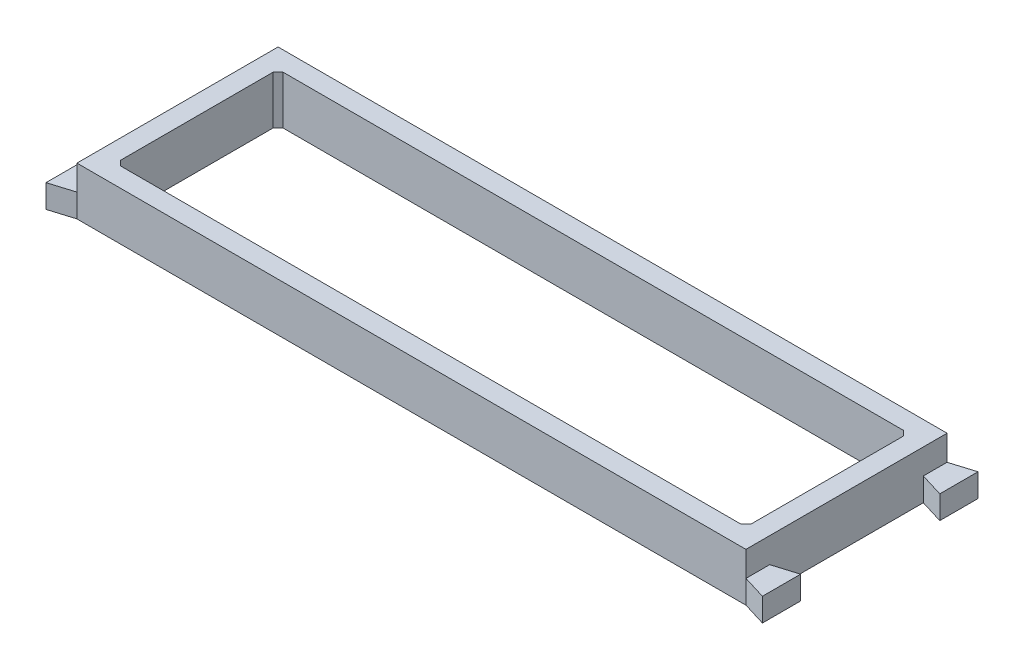
ISO-10303-21;
HEADER;
FILE_DESCRIPTION(('STEP AP214'),'2;1');
FILE_NAME('part.step','',(''),(''),'','','');
FILE_SCHEMA(('AUTOMOTIVE_DESIGN { 1 0 10303 214 1 1 1 1 }'));
ENDSEC;
DATA;
#1=APPLICATION_CONTEXT('core data for automotive mechanical design processes');
#2=APPLICATION_PROTOCOL_DEFINITION('international standard','automotive_design',2000,#1);
#3=PRODUCT_CONTEXT('',#1,'mechanical');
#4=PRODUCT('Part','Part','',(#3));
#5=PRODUCT_RELATED_PRODUCT_CATEGORY('part','',(#4));
#6=PRODUCT_DEFINITION_FORMATION('','',#4);
#7=PRODUCT_DEFINITION_CONTEXT('part definition',#1,'design');
#8=PRODUCT_DEFINITION('design','',#6,#7);
#9=PRODUCT_DEFINITION_SHAPE('','',#8);
#10=(LENGTH_UNIT() NAMED_UNIT(*) SI_UNIT(.MILLI.,.METRE.));
#11=(NAMED_UNIT(*) PLANE_ANGLE_UNIT() SI_UNIT($,.RADIAN.));
#12=(NAMED_UNIT(*) SI_UNIT($,.STERADIAN.) SOLID_ANGLE_UNIT());
#13=UNCERTAINTY_MEASURE_WITH_UNIT(LENGTH_MEASURE(1.E-05),#10,'distance_accuracy_value','');
#14=(GEOMETRIC_REPRESENTATION_CONTEXT(3) GLOBAL_UNCERTAINTY_ASSIGNED_CONTEXT((#13)) GLOBAL_UNIT_ASSIGNED_CONTEXT((#10,
#11,#12)) REPRESENTATION_CONTEXT('',''));
#15=CARTESIAN_POINT('',(0.,0.,0.));
#16=DIRECTION('',(0.,0.,1.));
#17=DIRECTION('',(1.,0.,0.));
#18=AXIS2_PLACEMENT_3D('',#15,#16,#17);
#19=CARTESIAN_POINT('',(-69.15,10.,-20.792494605));
#20=DIRECTION('',(1.,0.,0.));
#21=DIRECTION('',(0.,0.,-1.));
#22=AXIS2_PLACEMENT_3D('',#19,#20,#21);
#23=PLANE('',#22);
#24=DIRECTION('',(0.,0.,1.));
#25=VECTOR('',#24,1.);
#26=CARTESIAN_POINT('',(-69.15,4.80000000000048,-15.883333333333));
#27=LINE('',#26,#25);
#28=CARTESIAN_POINT('',(-69.15,4.80000000000048,-20.783333333333));
#29=VERTEX_POINT('',#28);
#30=CARTESIAN_POINT('',(-69.15,4.80000000000048,-15.883333333333));
#31=VERTEX_POINT('',#30);
#32=EDGE_CURVE('E51',#29,#31,#27,.T.);
#33=ORIENTED_EDGE('',*,*,#32,.T.);
#34=DIRECTION('',(0.,-1.,0.));
#35=VECTOR('',#34,1.);
#36=CARTESIAN_POINT('',(-69.15,4.80000000000048,-15.883333333333));
#37=LINE('',#36,#35);
#38=CARTESIAN_POINT('',(-69.15,4.83570165429774E-13,-15.883333333333));
#39=VERTEX_POINT('',#38);
#40=EDGE_CURVE('E249',#31,#39,#37,.T.);
#41=ORIENTED_EDGE('',*,*,#40,.T.);
#42=DIRECTION('',(0.,0.,1.));
#43=VECTOR('',#42,1.);
#44=CARTESIAN_POINT('',(-69.15,0.,-20.792494605));
#45=LINE('',#44,#43);
#46=CARTESIAN_POINT('',(-69.15,4.83570165429774E-13,15.883333333333));
#47=VERTEX_POINT('',#46);
#48=EDGE_CURVE('E416',#39,#47,#45,.T.);
#49=ORIENTED_EDGE('',*,*,#48,.T.);
#50=DIRECTION('',(0.,-1.,0.));
#51=VECTOR('',#50,1.);
#52=CARTESIAN_POINT('',(-69.15,4.80000000000048,15.883333333333));
#53=LINE('',#52,#51);
#54=CARTESIAN_POINT('',(-69.15,4.80000000000048,15.883333333333));
#55=VERTEX_POINT('',#54);
#56=EDGE_CURVE('E279',#55,#47,#53,.T.);
#57=ORIENTED_EDGE('',*,*,#56,.F.);
#58=DIRECTION('',(0.,0.,1.));
#59=VECTOR('',#58,1.);
#60=CARTESIAN_POINT('',(-69.15,4.80000000000048,20.783333333333));
#61=LINE('',#60,#59);
#62=CARTESIAN_POINT('',(-69.15,4.80000000000048,20.783333333333));
#63=VERTEX_POINT('',#62);
#64=EDGE_CURVE('E259',#55,#63,#61,.T.);
#65=ORIENTED_EDGE('',*,*,#64,.T.);
#66=DIRECTION('',(0.,-1.,0.));
#67=VECTOR('',#66,1.);
#68=CARTESIAN_POINT('',(-69.15,4.80000000000048,20.783333333333));
#69=LINE('',#68,#67);
#70=CARTESIAN_POINT('',(-69.15,0.,20.783333333333));
#71=VERTEX_POINT('',#70);
#72=EDGE_CURVE('E276',#63,#71,#69,.T.);
#73=ORIENTED_EDGE('',*,*,#72,.T.);
#74=CARTESIAN_POINT('',(-69.15,0.,20.792494605));
#75=VERTEX_POINT('',#74);
#76=EDGE_CURVE('E401',#71,#75,#45,.T.);
#77=ORIENTED_EDGE('',*,*,#76,.T.);
#78=DIRECTION('',(0.,-1.,0.));
#79=VECTOR('',#78,1.);
#80=CARTESIAN_POINT('',(-69.15,10.,20.792494605));
#81=LINE('',#80,#79);
#82=CARTESIAN_POINT('',(-69.15,10.,20.792494605));
#83=VERTEX_POINT('',#82);
#84=EDGE_CURVE('E11',#83,#75,#81,.T.);
#85=ORIENTED_EDGE('',*,*,#84,.F.);
#86=DIRECTION('',(0.,0.,1.));
#87=VECTOR('',#86,1.);
#88=CARTESIAN_POINT('',(-69.15,10.,-20.792494605));
#89=LINE('',#88,#87);
#90=CARTESIAN_POINT('',(-69.15,10.,-20.792494605));
#91=VERTEX_POINT('',#90);
#92=EDGE_CURVE('E402',#91,#83,#89,.T.);
#93=ORIENTED_EDGE('',*,*,#92,.F.);
#94=DIRECTION('',(0.,-1.,0.));
#95=VECTOR('',#94,1.);
#96=CARTESIAN_POINT('',(-69.15,10.,-20.792494605));
#97=LINE('',#96,#95);
#98=CARTESIAN_POINT('',(-69.15,0.,-20.792494605));
#99=VERTEX_POINT('',#98);
#100=EDGE_CURVE('E412',#91,#99,#97,.T.);
#101=ORIENTED_EDGE('',*,*,#100,.T.);
#102=CARTESIAN_POINT('',(-69.15,0.,-20.783333333333));
#103=VERTEX_POINT('',#102);
#104=EDGE_CURVE('E413',#99,#103,#45,.T.);
#105=ORIENTED_EDGE('',*,*,#104,.T.);
#106=DIRECTION('',(0.,-1.,0.));
#107=VECTOR('',#106,1.);
#108=CARTESIAN_POINT('',(-69.15,4.80000000000048,-20.783333333333));
#109=LINE('',#108,#107);
#110=EDGE_CURVE('E47',#29,#103,#109,.T.);
#111=ORIENTED_EDGE('',*,*,#110,.F.);
#112=EDGE_LOOP('',(#33,#41,#49,#57,#65,#73,#77,#85,#93,#101,#105,#111));
#113=FACE_BOUND('',#112,.T.);
#114=ADVANCED_FACE('F33',(#113),#23,.F.);
#115=CARTESIAN_POINT('',(69.15,10.,-20.792494605));
#116=DIRECTION('',(-1.,0.,0.));
#117=DIRECTION('',(0.,0.,1.));
#118=AXIS2_PLACEMENT_3D('',#115,#116,#117);
#119=PLANE('',#118);
#120=DIRECTION('',(0.,0.,-1.));
#121=VECTOR('',#120,1.);
#122=CARTESIAN_POINT('',(69.15,4.8,-15.883333333333));
#123=LINE('',#122,#121);
#124=CARTESIAN_POINT('',(69.15,4.8,-15.883333333333));
#125=VERTEX_POINT('',#124);
#126=CARTESIAN_POINT('',(69.15,4.8,-20.783333333333));
#127=VERTEX_POINT('',#126);
#128=EDGE_CURVE('E290',#125,#127,#123,.T.);
#129=ORIENTED_EDGE('',*,*,#128,.T.);
#130=DIRECTION('',(0.,-1.,0.));
#131=VECTOR('',#130,1.);
#132=CARTESIAN_POINT('',(69.15,4.8,-20.783333333333));
#133=LINE('',#132,#131);
#134=CARTESIAN_POINT('',(69.15,0.,-20.783333333333));
#135=VERTEX_POINT('',#134);
#136=EDGE_CURVE('E306',#127,#135,#133,.T.);
#137=ORIENTED_EDGE('',*,*,#136,.T.);
#138=DIRECTION('',(0.,0.,-1.));
#139=VECTOR('',#138,1.);
#140=CARTESIAN_POINT('',(69.15,0.,-20.792494605));
#141=LINE('',#140,#139);
#142=CARTESIAN_POINT('',(69.15,0.,-20.792494605));
#143=VERTEX_POINT('',#142);
#144=EDGE_CURVE('E418',#135,#143,#141,.T.);
#145=ORIENTED_EDGE('',*,*,#144,.T.);
#146=DIRECTION('',(0.,-1.,0.));
#147=VECTOR('',#146,1.);
#148=CARTESIAN_POINT('',(69.15,10.,-20.792494605));
#149=LINE('',#148,#147);
#150=CARTESIAN_POINT('',(69.15,10.,-20.792494605));
#151=VERTEX_POINT('',#150);
#152=EDGE_CURVE('E426',#151,#143,#149,.T.);
#153=ORIENTED_EDGE('',*,*,#152,.F.);
#154=DIRECTION('',(0.,0.,-1.));
#155=VECTOR('',#154,1.);
#156=CARTESIAN_POINT('',(69.15,10.,-20.792494605));
#157=LINE('',#156,#155);
#158=CARTESIAN_POINT('',(69.15,10.,20.792494605));
#159=VERTEX_POINT('',#158);
#160=EDGE_CURVE('E408',#159,#151,#157,.T.);
#161=ORIENTED_EDGE('',*,*,#160,.F.);
#162=DIRECTION('',(0.,-1.,0.));
#163=VECTOR('',#162,1.);
#164=CARTESIAN_POINT('',(69.15,10.,20.792494605));
#165=LINE('',#164,#163);
#166=CARTESIAN_POINT('',(69.15,0.,20.792494605));
#167=VERTEX_POINT('',#166);
#168=EDGE_CURVE('E40',#159,#167,#165,.T.);
#169=ORIENTED_EDGE('',*,*,#168,.T.);
#170=CARTESIAN_POINT('',(69.15,0.,20.783333333333));
#171=VERTEX_POINT('',#170);
#172=EDGE_CURVE('E419',#167,#171,#141,.T.);
#173=ORIENTED_EDGE('',*,*,#172,.T.);
#174=DIRECTION('',(0.,-1.,0.));
#175=VECTOR('',#174,1.);
#176=CARTESIAN_POINT('',(69.15,4.8,20.783333333333));
#177=LINE('',#176,#175);
#178=CARTESIAN_POINT('',(69.15,4.8,20.783333333333));
#179=VERTEX_POINT('',#178);
#180=EDGE_CURVE('E340',#179,#171,#177,.T.);
#181=ORIENTED_EDGE('',*,*,#180,.F.);
#182=DIRECTION('',(0.,0.,-1.));
#183=VECTOR('',#182,1.);
#184=CARTESIAN_POINT('',(69.15,4.8,20.783333333333));
#185=LINE('',#184,#183);
#186=CARTESIAN_POINT('',(69.15,4.8,15.883333333333));
#187=VERTEX_POINT('',#186);
#188=EDGE_CURVE('E320',#179,#187,#185,.T.);
#189=ORIENTED_EDGE('',*,*,#188,.T.);
#190=DIRECTION('',(0.,-1.,0.));
#191=VECTOR('',#190,1.);
#192=CARTESIAN_POINT('',(69.15,4.8,15.883333333333));
#193=LINE('',#192,#191);
#194=CARTESIAN_POINT('',(69.15,0.,15.883333333333));
#195=VERTEX_POINT('',#194);
#196=EDGE_CURVE('E337',#187,#195,#193,.T.);
#197=ORIENTED_EDGE('',*,*,#196,.T.);
#198=CARTESIAN_POINT('',(69.15,0.,-15.883333333333));
#199=VERTEX_POINT('',#198);
#200=EDGE_CURVE('E422',#195,#199,#141,.T.);
#201=ORIENTED_EDGE('',*,*,#200,.T.);
#202=DIRECTION('',(0.,-1.,0.));
#203=VECTOR('',#202,1.);
#204=CARTESIAN_POINT('',(69.15,4.8,-15.883333333333));
#205=LINE('',#204,#203);
#206=EDGE_CURVE('E309',#125,#199,#205,.T.);
#207=ORIENTED_EDGE('',*,*,#206,.F.);
#208=EDGE_LOOP('',(#129,#137,#145,#153,#161,#169,#173,#181,#189,#197,#201,#207));
#209=FACE_BOUND('',#208,.T.);
#210=ADVANCED_FACE('F433',(#209),#119,.F.);
#211=CARTESIAN_POINT('',(0.,10.,0.));
#212=DIRECTION('',(0.,1.,0.));
#213=DIRECTION('',(0.,0.,1.));
#214=AXIS2_PLACEMENT_3D('',#211,#212,#213);
#215=PLANE('',#214);
#216=ORIENTED_EDGE('',*,*,#92,.T.);
#217=DIRECTION('',(1.,0.,0.));
#218=VECTOR('',#217,1.);
#219=CARTESIAN_POINT('',(-69.15,10.,20.792494605));
#220=LINE('',#219,#218);
#221=EDGE_CURVE('E405',#83,#159,#220,.T.);
#222=ORIENTED_EDGE('',*,*,#221,.T.);
#223=ORIENTED_EDGE('',*,*,#160,.T.);
#224=DIRECTION('',(-1.,0.,0.));
#225=VECTOR('',#224,1.);
#226=CARTESIAN_POINT('',(-69.15,10.,-20.792494605));
#227=LINE('',#226,#225);
#228=EDGE_CURVE('E410',#151,#91,#227,.T.);
#229=ORIENTED_EDGE('',*,*,#228,.T.);
#230=EDGE_LOOP('',(#216,#222,#223,#229));
#231=FACE_BOUND('',#230,.T.);
#232=DIRECTION('',(0.,0.,1.));
#233=VECTOR('',#232,1.);
#234=CARTESIAN_POINT('',(-65.15,10.,-15.792494605));
#235=LINE('',#234,#233);
#236=CARTESIAN_POINT('',(-65.15,10.,-15.792494605));
#237=VERTEX_POINT('',#236);
#238=CARTESIAN_POINT('',(-65.15,10.,15.792494605));
#239=VERTEX_POINT('',#238);
#240=EDGE_CURVE('E345',#237,#239,#235,.T.);
#241=ORIENTED_EDGE('',*,*,#240,.F.);
#242=DIRECTION('',(-0.707106781186547,0.,0.707106781186547));
#243=VECTOR('',#242,1.);
#244=CARTESIAN_POINT('',(-65.15,10.,-15.792494605));
#245=LINE('',#244,#243);
#246=CARTESIAN_POINT('',(-64.15,10.,-16.792494605));
#247=VERTEX_POINT('',#246);
#248=EDGE_CURVE('E343',#247,#237,#245,.T.);
#249=ORIENTED_EDGE('',*,*,#248,.F.);
#250=DIRECTION('',(-1.,0.,0.));
#251=VECTOR('',#250,1.);
#252=CARTESIAN_POINT('',(-64.15,10.,-16.792494605));
#253=LINE('',#252,#251);
#254=CARTESIAN_POINT('',(64.15,10.,-16.792494605));
#255=VERTEX_POINT('',#254);
#256=EDGE_CURVE('E359',#255,#247,#253,.T.);
#257=ORIENTED_EDGE('',*,*,#256,.F.);
#258=DIRECTION('',(-0.707106781186547,0.,-0.707106781186547));
#259=VECTOR('',#258,1.);
#260=CARTESIAN_POINT('',(64.15,10.,-16.792494605));
#261=LINE('',#260,#259);
#262=CARTESIAN_POINT('',(65.15,10.,-15.792494605));
#263=VERTEX_POINT('',#262);
#264=EDGE_CURVE('E356',#263,#255,#261,.T.);
#265=ORIENTED_EDGE('',*,*,#264,.F.);
#266=DIRECTION('',(0.,0.,-1.));
#267=VECTOR('',#266,1.);
#268=CARTESIAN_POINT('',(65.15,10.,-15.792494605));
#269=LINE('',#268,#267);
#270=CARTESIAN_POINT('',(65.15,10.,15.792494605));
#271=VERTEX_POINT('',#270);
#272=EDGE_CURVE('E354',#271,#263,#269,.T.);
#273=ORIENTED_EDGE('',*,*,#272,.F.);
#274=DIRECTION('',(0.707106781186547,0.,-0.707106781186547));
#275=VECTOR('',#274,1.);
#276=CARTESIAN_POINT('',(64.15,10.,16.792494605));
#277=LINE('',#276,#275);
#278=CARTESIAN_POINT('',(64.15,10.,16.792494605));
#279=VERTEX_POINT('',#278);
#280=EDGE_CURVE('E352',#279,#271,#277,.T.);
#281=ORIENTED_EDGE('',*,*,#280,.F.);
#282=DIRECTION('',(1.,0.,0.));
#283=VECTOR('',#282,1.);
#284=CARTESIAN_POINT('',(-64.15,10.,16.792494605));
#285=LINE('',#284,#283);
#286=CARTESIAN_POINT('',(-64.15,10.,16.792494605));
#287=VERTEX_POINT('',#286);
#288=EDGE_CURVE('E350',#287,#279,#285,.T.);
#289=ORIENTED_EDGE('',*,*,#288,.F.);
#290=DIRECTION('',(0.707106781186547,0.,0.707106781186547));
#291=VECTOR('',#290,1.);
#292=CARTESIAN_POINT('',(-65.15,10.,15.792494605));
#293=LINE('',#292,#291);
#294=EDGE_CURVE('E348',#239,#287,#293,.T.);
#295=ORIENTED_EDGE('',*,*,#294,.F.);
#296=EDGE_LOOP('',(#241,#249,#257,#265,#273,#281,#289,#295));
#297=FACE_BOUND('',#296,.T.);
#298=ADVANCED_FACE('F466',(#231,#297),#215,.T.);
#299=CARTESIAN_POINT('',(0.,0.,0.));
#300=DIRECTION('',(0.,1.,0.));
#301=DIRECTION('',(0.,0.,1.));
#302=AXIS2_PLACEMENT_3D('',#299,#300,#301);
#303=PLANE('',#302);
#304=ORIENTED_EDGE('',*,*,#104,.F.);
#305=DIRECTION('',(-1.,0.,0.));
#306=VECTOR('',#305,1.);
#307=CARTESIAN_POINT('',(-69.15,0.,-20.792494605));
#308=LINE('',#307,#306);
#309=EDGE_CURVE('E406',#143,#99,#308,.T.);
#310=ORIENTED_EDGE('',*,*,#309,.F.);
#311=ORIENTED_EDGE('',*,*,#144,.F.);
#312=DIRECTION('',(0.956199955507432,0.,-0.292714272094111));
#313=VECTOR('',#312,1.);
#314=CARTESIAN_POINT('',(74.05,0.,-22.283333333333));
#315=LINE('',#314,#313);
#316=CARTESIAN_POINT('',(74.05,0.,-22.283333333333));
#317=VERTEX_POINT('',#316);
#318=EDGE_CURVE('E287',#135,#317,#315,.T.);
#319=ORIENTED_EDGE('',*,*,#318,.T.);
#320=DIRECTION('',(0.,0.,1.));
#321=VECTOR('',#320,1.);
#322=CARTESIAN_POINT('',(74.05,0.,-14.383333333333));
#323=LINE('',#322,#321);
#324=CARTESIAN_POINT('',(74.05,0.,-14.383333333333));
#325=VERTEX_POINT('',#324);
#326=EDGE_CURVE('E275',#317,#325,#323,.T.);
#327=ORIENTED_EDGE('',*,*,#326,.T.);
#328=DIRECTION('',(-0.956199955507432,0.,-0.292714272094111));
#329=VECTOR('',#328,1.);
#330=CARTESIAN_POINT('',(74.05,0.,-14.383333333333));
#331=LINE('',#330,#329);
#332=EDGE_CURVE('E298',#325,#199,#331,.T.);
#333=ORIENTED_EDGE('',*,*,#332,.T.);
#334=ORIENTED_EDGE('',*,*,#200,.F.);
#335=DIRECTION('',(0.956199955507432,0.,-0.292714272094111));
#336=VECTOR('',#335,1.);
#337=CARTESIAN_POINT('',(74.05,0.,14.383333333333));
#338=LINE('',#337,#336);
#339=CARTESIAN_POINT('',(74.05,0.,14.383333333333));
#340=VERTEX_POINT('',#339);
#341=EDGE_CURVE('E317',#195,#340,#338,.T.);
#342=ORIENTED_EDGE('',*,*,#341,.T.);
#343=DIRECTION('',(0.,0.,1.));
#344=VECTOR('',#343,1.);
#345=CARTESIAN_POINT('',(74.05,0.,22.283333333333));
#346=LINE('',#345,#344);
#347=CARTESIAN_POINT('',(74.05,0.,22.283333333333));
#348=VERTEX_POINT('',#347);
#349=EDGE_CURVE('E305',#340,#348,#346,.T.);
#350=ORIENTED_EDGE('',*,*,#349,.T.);
#351=DIRECTION('',(-0.956199955507432,0.,-0.292714272094111));
#352=VECTOR('',#351,1.);
#353=CARTESIAN_POINT('',(74.05,0.,22.283333333333));
#354=LINE('',#353,#352);
#355=EDGE_CURVE('E329',#348,#171,#354,.T.);
#356=ORIENTED_EDGE('',*,*,#355,.T.);
#357=ORIENTED_EDGE('',*,*,#172,.F.);
#358=DIRECTION('',(1.,0.,0.));
#359=VECTOR('',#358,1.);
#360=CARTESIAN_POINT('',(-69.15,0.,20.792494605));
#361=LINE('',#360,#359);
#362=EDGE_CURVE('E415',#75,#167,#361,.T.);
#363=ORIENTED_EDGE('',*,*,#362,.F.);
#364=ORIENTED_EDGE('',*,*,#76,.F.);
#365=DIRECTION('',(-0.956199955507432,0.,0.29271427209411));
#366=VECTOR('',#365,1.);
#367=CARTESIAN_POINT('',(-74.05,5.17786682550437E-13,22.283333333333));
#368=LINE('',#367,#366);
#369=CARTESIAN_POINT('',(-74.05,5.17786682550437E-13,22.283333333333));
#370=VERTEX_POINT('',#369);
#371=EDGE_CURVE('E256',#71,#370,#368,.T.);
#372=ORIENTED_EDGE('',*,*,#371,.T.);
#373=DIRECTION('',(0.,0.,-1.));
#374=VECTOR('',#373,1.);
#375=CARTESIAN_POINT('',(-74.05,5.17786682550437E-13,22.283333333333));
#376=LINE('',#375,#374);
#377=CARTESIAN_POINT('',(-74.05,5.17786682550437E-13,14.383333333333));
#378=VERTEX_POINT('',#377);
#379=EDGE_CURVE('E248',#370,#378,#376,.T.);
#380=ORIENTED_EDGE('',*,*,#379,.T.);
#381=DIRECTION('',(0.956199955507431,0.,0.292714272094113));
#382=VECTOR('',#381,1.);
#383=CARTESIAN_POINT('',(-74.05,5.17786682550437E-13,14.383333333333));
#384=LINE('',#383,#382);
#385=EDGE_CURVE('E268',#378,#47,#384,.T.);
#386=ORIENTED_EDGE('',*,*,#385,.T.);
#387=ORIENTED_EDGE('',*,*,#48,.F.);
#388=DIRECTION('',(-0.956199955507432,0.,0.29271427209411));
#389=VECTOR('',#388,1.);
#390=CARTESIAN_POINT('',(-74.05,5.17786682550437E-13,-14.383333333333));
#391=LINE('',#390,#389);
#392=CARTESIAN_POINT('',(-74.05,5.17786682550437E-13,-14.383333333333));
#393=VERTEX_POINT('',#392);
#394=EDGE_CURVE('E237',#39,#393,#391,.T.);
#395=ORIENTED_EDGE('',*,*,#394,.T.);
#396=DIRECTION('',(0.,0.,-1.));
#397=VECTOR('',#396,1.);
#398=CARTESIAN_POINT('',(-74.05,5.17786682550437E-13,-14.383333333333));
#399=LINE('',#398,#397);
#400=CARTESIAN_POINT('',(-74.05,5.17786682550436E-13,-22.283333333333));
#401=VERTEX_POINT('',#400);
#402=EDGE_CURVE('E244',#393,#401,#399,.T.);
#403=ORIENTED_EDGE('',*,*,#402,.T.);
#404=DIRECTION('',(0.956199955507431,0.,0.292714272094113));
#405=VECTOR('',#404,1.);
#406=CARTESIAN_POINT('',(-74.05,5.17786682550436E-13,-22.283333333333));
#407=LINE('',#406,#405);
#408=EDGE_CURVE('E221',#401,#103,#407,.T.);
#409=ORIENTED_EDGE('',*,*,#408,.T.);
#410=EDGE_LOOP('',(#304,#310,#311,#319,#327,#333,#334,#342,#350,#356,#357,#363,#364,#372,#380,
#386,#387,#395,#403,#409));
#411=FACE_BOUND('',#410,.T.);
#412=DIRECTION('',(-0.707106781186547,0.,0.707106781186547));
#413=VECTOR('',#412,1.);
#414=CARTESIAN_POINT('',(-65.15,0.,-15.792494605));
#415=LINE('',#414,#413);
#416=CARTESIAN_POINT('',(-64.15,0.,-16.792494605));
#417=VERTEX_POINT('',#416);
#418=CARTESIAN_POINT('',(-65.15,0.,-15.792494605));
#419=VERTEX_POINT('',#418);
#420=EDGE_CURVE('E336',#417,#419,#415,.T.);
#421=ORIENTED_EDGE('',*,*,#420,.T.);
#422=DIRECTION('',(0.,0.,1.));
#423=VECTOR('',#422,1.);
#424=CARTESIAN_POINT('',(-65.15,0.,-15.792494605));
#425=LINE('',#424,#423);
#426=CARTESIAN_POINT('',(-65.15,0.,15.792494605));
#427=VERTEX_POINT('',#426);
#428=EDGE_CURVE('E364',#419,#427,#425,.T.);
#429=ORIENTED_EDGE('',*,*,#428,.T.);
#430=DIRECTION('',(0.707106781186547,0.,0.707106781186547));
#431=VECTOR('',#430,1.);
#432=CARTESIAN_POINT('',(-65.15,0.,15.792494605));
#433=LINE('',#432,#431);
#434=CARTESIAN_POINT('',(-64.15,0.,16.792494605));
#435=VERTEX_POINT('',#434);
#436=EDGE_CURVE('E367',#427,#435,#433,.T.);
#437=ORIENTED_EDGE('',*,*,#436,.T.);
#438=DIRECTION('',(1.,0.,0.));
#439=VECTOR('',#438,1.);
#440=CARTESIAN_POINT('',(-64.15,0.,16.792494605));
#441=LINE('',#440,#439);
#442=CARTESIAN_POINT('',(64.15,0.,16.792494605));
#443=VERTEX_POINT('',#442);
#444=EDGE_CURVE('E370',#435,#443,#441,.T.);
#445=ORIENTED_EDGE('',*,*,#444,.T.);
#446=DIRECTION('',(0.707106781186547,0.,-0.707106781186547));
#447=VECTOR('',#446,1.);
#448=CARTESIAN_POINT('',(64.15,0.,16.792494605));
#449=LINE('',#448,#447);
#450=CARTESIAN_POINT('',(65.15,0.,15.792494605));
#451=VERTEX_POINT('',#450);
#452=EDGE_CURVE('E373',#443,#451,#449,.T.);
#453=ORIENTED_EDGE('',*,*,#452,.T.);
#454=DIRECTION('',(0.,0.,-1.));
#455=VECTOR('',#454,1.);
#456=CARTESIAN_POINT('',(65.15,0.,-15.792494605));
#457=LINE('',#456,#455);
#458=CARTESIAN_POINT('',(65.15,0.,-15.792494605));
#459=VERTEX_POINT('',#458);
#460=EDGE_CURVE('E376',#451,#459,#457,.T.);
#461=ORIENTED_EDGE('',*,*,#460,.T.);
#462=DIRECTION('',(-0.707106781186547,0.,-0.707106781186547));
#463=VECTOR('',#462,1.);
#464=CARTESIAN_POINT('',(64.15,0.,-16.792494605));
#465=LINE('',#464,#463);
#466=CARTESIAN_POINT('',(64.15,0.,-16.792494605));
#467=VERTEX_POINT('',#466);
#468=EDGE_CURVE('E379',#459,#467,#465,.T.);
#469=ORIENTED_EDGE('',*,*,#468,.T.);
#470=DIRECTION('',(-1.,0.,0.));
#471=VECTOR('',#470,1.);
#472=CARTESIAN_POINT('',(-64.15,0.,-16.792494605));
#473=LINE('',#472,#471);
#474=EDGE_CURVE('E346',#467,#417,#473,.T.);
#475=ORIENTED_EDGE('',*,*,#474,.T.);
#476=EDGE_LOOP('',(#421,#429,#437,#445,#453,#461,#469,#475));
#477=FACE_BOUND('',#476,.T.);
#478=ADVANCED_FACE('F440',(#411,#477),#303,.F.);
#479=CARTESIAN_POINT('',(-69.15,10.,20.792494605));
#480=DIRECTION('',(0.,0.,-1.));
#481=DIRECTION('',(-1.,0.,0.));
#482=AXIS2_PLACEMENT_3D('',#479,#480,#481);
#483=PLANE('',#482);
#484=ORIENTED_EDGE('',*,*,#362,.T.);
#485=ORIENTED_EDGE('',*,*,#168,.F.);
#486=ORIENTED_EDGE('',*,*,#221,.F.);
#487=ORIENTED_EDGE('',*,*,#84,.T.);
#488=EDGE_LOOP('',(#484,#485,#486,#487));
#489=FACE_BOUND('',#488,.T.);
#490=ADVANCED_FACE('F468',(#489),#483,.F.);
#491=CARTESIAN_POINT('',(-69.15,10.,-20.792494605));
#492=DIRECTION('',(0.,0.,1.));
#493=DIRECTION('',(1.,0.,0.));
#494=AXIS2_PLACEMENT_3D('',#491,#492,#493);
#495=PLANE('',#494);
#496=ORIENTED_EDGE('',*,*,#309,.T.);
#497=ORIENTED_EDGE('',*,*,#100,.F.);
#498=ORIENTED_EDGE('',*,*,#228,.F.);
#499=ORIENTED_EDGE('',*,*,#152,.T.);
#500=EDGE_LOOP('',(#496,#497,#498,#499));
#501=FACE_BOUND('',#500,.T.);
#502=ADVANCED_FACE('F461',(#501),#495,.F.);
#503=CARTESIAN_POINT('',(-65.15,10.,-15.792494605));
#504=DIRECTION('',(0.707106781186548,0.,0.707106781186548));
#505=DIRECTION('',(0.707106781186548,0.,-0.707106781186548));
#506=AXIS2_PLACEMENT_3D('',#503,#504,#505);
#507=PLANE('',#506);
#508=ORIENTED_EDGE('',*,*,#420,.F.);
#509=DIRECTION('',(0.,-1.,0.));
#510=VECTOR('',#509,1.);
#511=CARTESIAN_POINT('',(-64.15,10.,-16.792494605));
#512=LINE('',#511,#510);
#513=EDGE_CURVE('E361',#247,#417,#512,.T.);
#514=ORIENTED_EDGE('',*,*,#513,.F.);
#515=ORIENTED_EDGE('',*,*,#248,.T.);
#516=DIRECTION('',(0.,-1.,0.));
#517=VECTOR('',#516,1.);
#518=CARTESIAN_POINT('',(-65.15,10.,-15.792494605));
#519=LINE('',#518,#517);
#520=EDGE_CURVE('E398',#237,#419,#519,.T.);
#521=ORIENTED_EDGE('',*,*,#520,.T.);
#522=EDGE_LOOP('',(#508,#514,#515,#521));
#523=FACE_BOUND('',#522,.T.);
#524=ADVANCED_FACE('F474',(#523),#507,.T.);
#525=CARTESIAN_POINT('',(-65.15,10.,-15.792494605));
#526=DIRECTION('',(1.,0.,0.));
#527=DIRECTION('',(0.,0.,-1.));
#528=AXIS2_PLACEMENT_3D('',#525,#526,#527);
#529=PLANE('',#528);
#530=ORIENTED_EDGE('',*,*,#428,.F.);
#531=ORIENTED_EDGE('',*,*,#520,.F.);
#532=ORIENTED_EDGE('',*,*,#240,.T.);
#533=DIRECTION('',(0.,-1.,0.));
#534=VECTOR('',#533,1.);
#535=CARTESIAN_POINT('',(-65.15,10.,15.792494605));
#536=LINE('',#535,#534);
#537=EDGE_CURVE('E396',#239,#427,#536,.T.);
#538=ORIENTED_EDGE('',*,*,#537,.T.);
#539=EDGE_LOOP('',(#530,#531,#532,#538));
#540=FACE_BOUND('',#539,.T.);
#541=ADVANCED_FACE('F489',(#540),#529,.T.);
#542=CARTESIAN_POINT('',(-65.15,10.,15.792494605));
#543=DIRECTION('',(0.707106781186548,0.,-0.707106781186548));
#544=DIRECTION('',(-0.707106781186548,0.,-0.707106781186548));
#545=AXIS2_PLACEMENT_3D('',#542,#543,#544);
#546=PLANE('',#545);
#547=ORIENTED_EDGE('',*,*,#436,.F.);
#548=ORIENTED_EDGE('',*,*,#537,.F.);
#549=ORIENTED_EDGE('',*,*,#294,.T.);
#550=DIRECTION('',(0.,-1.,0.));
#551=VECTOR('',#550,1.);
#552=CARTESIAN_POINT('',(-64.15,10.,16.792494605));
#553=LINE('',#552,#551);
#554=EDGE_CURVE('E394',#287,#435,#553,.T.);
#555=ORIENTED_EDGE('',*,*,#554,.T.);
#556=EDGE_LOOP('',(#547,#548,#549,#555));
#557=FACE_BOUND('',#556,.T.);
#558=ADVANCED_FACE('F493',(#557),#546,.T.);
#559=CARTESIAN_POINT('',(-64.15,10.,16.792494605));
#560=DIRECTION('',(0.,0.,-1.));
#561=DIRECTION('',(-1.,0.,0.));
#562=AXIS2_PLACEMENT_3D('',#559,#560,#561);
#563=PLANE('',#562);
#564=ORIENTED_EDGE('',*,*,#444,.F.);
#565=ORIENTED_EDGE('',*,*,#554,.F.);
#566=ORIENTED_EDGE('',*,*,#288,.T.);
#567=DIRECTION('',(0.,-1.,0.));
#568=VECTOR('',#567,1.);
#569=CARTESIAN_POINT('',(64.15,10.,16.792494605));
#570=LINE('',#569,#568);
#571=EDGE_CURVE('E392',#279,#443,#570,.T.);
#572=ORIENTED_EDGE('',*,*,#571,.T.);
#573=EDGE_LOOP('',(#564,#565,#566,#572));
#574=FACE_BOUND('',#573,.T.);
#575=ADVANCED_FACE('F497',(#574),#563,.T.);
#576=CARTESIAN_POINT('',(64.15,10.,16.792494605));
#577=DIRECTION('',(-0.707106781186548,0.,-0.707106781186548));
#578=DIRECTION('',(-0.707106781186548,0.,0.707106781186548));
#579=AXIS2_PLACEMENT_3D('',#576,#577,#578);
#580=PLANE('',#579);
#581=ORIENTED_EDGE('',*,*,#452,.F.);
#582=ORIENTED_EDGE('',*,*,#571,.F.);
#583=ORIENTED_EDGE('',*,*,#280,.T.);
#584=DIRECTION('',(0.,-1.,0.));
#585=VECTOR('',#584,1.);
#586=CARTESIAN_POINT('',(65.15,10.,15.792494605));
#587=LINE('',#586,#585);
#588=EDGE_CURVE('E390',#271,#451,#587,.T.);
#589=ORIENTED_EDGE('',*,*,#588,.T.);
#590=EDGE_LOOP('',(#581,#582,#583,#589));
#591=FACE_BOUND('',#590,.T.);
#592=ADVANCED_FACE('F501',(#591),#580,.T.);
#593=CARTESIAN_POINT('',(65.15,10.,-15.792494605));
#594=DIRECTION('',(-1.,0.,0.));
#595=DIRECTION('',(0.,0.,1.));
#596=AXIS2_PLACEMENT_3D('',#593,#594,#595);
#597=PLANE('',#596);
#598=ORIENTED_EDGE('',*,*,#460,.F.);
#599=ORIENTED_EDGE('',*,*,#588,.F.);
#600=ORIENTED_EDGE('',*,*,#272,.T.);
#601=DIRECTION('',(0.,-1.,0.));
#602=VECTOR('',#601,1.);
#603=CARTESIAN_POINT('',(65.15,10.,-15.792494605));
#604=LINE('',#603,#602);
#605=EDGE_CURVE('E388',#263,#459,#604,.T.);
#606=ORIENTED_EDGE('',*,*,#605,.T.);
#607=EDGE_LOOP('',(#598,#599,#600,#606));
#608=FACE_BOUND('',#607,.T.);
#609=ADVANCED_FACE('F505',(#608),#597,.T.);
#610=CARTESIAN_POINT('',(64.15,10.,-16.792494605));
#611=DIRECTION('',(-0.707106781186548,0.,0.707106781186548));
#612=DIRECTION('',(0.707106781186548,0.,0.707106781186548));
#613=AXIS2_PLACEMENT_3D('',#610,#611,#612);
#614=PLANE('',#613);
#615=ORIENTED_EDGE('',*,*,#468,.F.);
#616=ORIENTED_EDGE('',*,*,#605,.F.);
#617=ORIENTED_EDGE('',*,*,#264,.T.);
#618=DIRECTION('',(0.,-1.,0.));
#619=VECTOR('',#618,1.);
#620=CARTESIAN_POINT('',(64.15,10.,-16.792494605));
#621=LINE('',#620,#619);
#622=EDGE_CURVE('E386',#255,#467,#621,.T.);
#623=ORIENTED_EDGE('',*,*,#622,.T.);
#624=EDGE_LOOP('',(#615,#616,#617,#623));
#625=FACE_BOUND('',#624,.T.);
#626=ADVANCED_FACE('F509',(#625),#614,.T.);
#627=CARTESIAN_POINT('',(-64.15,10.,-16.792494605));
#628=DIRECTION('',(0.,0.,1.));
#629=DIRECTION('',(1.,0.,0.));
#630=AXIS2_PLACEMENT_3D('',#627,#628,#629);
#631=PLANE('',#630);
#632=ORIENTED_EDGE('',*,*,#474,.F.);
#633=ORIENTED_EDGE('',*,*,#622,.F.);
#634=ORIENTED_EDGE('',*,*,#256,.T.);
#635=ORIENTED_EDGE('',*,*,#513,.T.);
#636=EDGE_LOOP('',(#632,#633,#634,#635));
#637=FACE_BOUND('',#636,.T.);
#638=ADVANCED_FACE('F513',(#637),#631,.T.);
#639=CARTESIAN_POINT('',(74.05,4.8,22.283333333333));
#640=DIRECTION('',(1.,0.,0.));
#641=DIRECTION('',(0.,0.,-1.));
#642=AXIS2_PLACEMENT_3D('',#639,#640,#641);
#643=PLANE('',#642);
#644=ORIENTED_EDGE('',*,*,#349,.F.);
#645=DIRECTION('',(0.,-1.,0.));
#646=VECTOR('',#645,1.);
#647=CARTESIAN_POINT('',(74.05,4.8,14.383333333333));
#648=LINE('',#647,#646);
#649=CARTESIAN_POINT('',(74.05,4.8,14.383333333333));
#650=VERTEX_POINT('',#649);
#651=EDGE_CURVE('E334',#650,#340,#648,.T.);
#652=ORIENTED_EDGE('',*,*,#651,.F.);
#653=DIRECTION('',(0.,0.,1.));
#654=VECTOR('',#653,1.);
#655=CARTESIAN_POINT('',(74.05,4.8,22.283333333333));
#656=LINE('',#655,#654);
#657=CARTESIAN_POINT('',(74.05,4.8,22.283333333333));
#658=VERTEX_POINT('',#657);
#659=EDGE_CURVE('E313',#650,#658,#656,.T.);
#660=ORIENTED_EDGE('',*,*,#659,.T.);
#661=DIRECTION('',(0.,-1.,0.));
#662=VECTOR('',#661,1.);
#663=CARTESIAN_POINT('',(74.05,4.8,22.283333333333));
#664=LINE('',#663,#662);
#665=EDGE_CURVE('E326',#658,#348,#664,.T.);
#666=ORIENTED_EDGE('',*,*,#665,.T.);
#667=EDGE_LOOP('',(#644,#652,#660,#666));
#668=FACE_BOUND('',#667,.T.);
#669=ADVANCED_FACE('F517',(#668),#643,.T.);
#670=CARTESIAN_POINT('',(74.05,4.8,14.383333333333));
#671=DIRECTION('',(-0.292714272094111,0.,-0.956199955507432));
#672=DIRECTION('',(-0.956199955507432,0.,0.292714272094111));
#673=AXIS2_PLACEMENT_3D('',#670,#671,#672);
#674=PLANE('',#673);
#675=ORIENTED_EDGE('',*,*,#341,.F.);
#676=ORIENTED_EDGE('',*,*,#196,.F.);
#677=DIRECTION('',(0.956199955507432,0.,-0.292714272094111));
#678=VECTOR('',#677,1.);
#679=CARTESIAN_POINT('',(74.05,4.8,14.383333333333));
#680=LINE('',#679,#678);
#681=EDGE_CURVE('E323',#187,#650,#680,.T.);
#682=ORIENTED_EDGE('',*,*,#681,.T.);
#683=ORIENTED_EDGE('',*,*,#651,.T.);
#684=EDGE_LOOP('',(#675,#676,#682,#683));
#685=FACE_BOUND('',#684,.T.);
#686=ADVANCED_FACE('F454',(#685),#674,.T.);
#687=CARTESIAN_POINT('',(74.05,4.8,22.283333333333));
#688=DIRECTION('',(-0.292714272094111,0.,0.956199955507432));
#689=DIRECTION('',(0.956199955507432,0.,0.292714272094111));
#690=AXIS2_PLACEMENT_3D('',#687,#688,#689);
#691=PLANE('',#690);
#692=ORIENTED_EDGE('',*,*,#355,.F.);
#693=ORIENTED_EDGE('',*,*,#665,.F.);
#694=DIRECTION('',(-0.956199955507432,0.,-0.292714272094111));
#695=VECTOR('',#694,1.);
#696=CARTESIAN_POINT('',(74.05,4.8,22.283333333333));
#697=LINE('',#696,#695);
#698=EDGE_CURVE('E316',#658,#179,#697,.T.);
#699=ORIENTED_EDGE('',*,*,#698,.T.);
#700=ORIENTED_EDGE('',*,*,#180,.T.);
#701=EDGE_LOOP('',(#692,#693,#699,#700));
#702=FACE_BOUND('',#701,.T.);
#703=ADVANCED_FACE('F446',(#702),#691,.T.);
#704=CARTESIAN_POINT('',(0.,4.8,0.));
#705=DIRECTION('',(0.,1.,0.));
#706=DIRECTION('',(0.,0.,1.));
#707=AXIS2_PLACEMENT_3D('',#704,#705,#706);
#708=PLANE('',#707);
#709=ORIENTED_EDGE('',*,*,#659,.F.);
#710=ORIENTED_EDGE('',*,*,#681,.F.);
#711=ORIENTED_EDGE('',*,*,#188,.F.);
#712=ORIENTED_EDGE('',*,*,#698,.F.);
#713=EDGE_LOOP('',(#709,#710,#711,#712));
#714=FACE_BOUND('',#713,.T.);
#715=ADVANCED_FACE('F452',(#714),#708,.T.);
#716=CARTESIAN_POINT('',(74.05,4.8,-14.383333333333));
#717=DIRECTION('',(1.,0.,0.));
#718=DIRECTION('',(0.,0.,-1.));
#719=AXIS2_PLACEMENT_3D('',#716,#717,#718);
#720=PLANE('',#719);
#721=ORIENTED_EDGE('',*,*,#326,.F.);
#722=DIRECTION('',(0.,-1.,0.));
#723=VECTOR('',#722,1.);
#724=CARTESIAN_POINT('',(74.05,4.8,-22.283333333333));
#725=LINE('',#724,#723);
#726=CARTESIAN_POINT('',(74.05,4.8,-22.283333333333));
#727=VERTEX_POINT('',#726);
#728=EDGE_CURVE('E303',#727,#317,#725,.T.);
#729=ORIENTED_EDGE('',*,*,#728,.F.);
#730=DIRECTION('',(0.,0.,1.));
#731=VECTOR('',#730,1.);
#732=CARTESIAN_POINT('',(74.05,4.8,-14.383333333333));
#733=LINE('',#732,#731);
#734=CARTESIAN_POINT('',(74.05,4.8,-14.383333333333));
#735=VERTEX_POINT('',#734);
#736=EDGE_CURVE('E283',#727,#735,#733,.T.);
#737=ORIENTED_EDGE('',*,*,#736,.T.);
#738=DIRECTION('',(0.,-1.,0.));
#739=VECTOR('',#738,1.);
#740=CARTESIAN_POINT('',(74.05,4.8,-14.383333333333));
#741=LINE('',#740,#739);
#742=EDGE_CURVE('E295',#735,#325,#741,.T.);
#743=ORIENTED_EDGE('',*,*,#742,.T.);
#744=EDGE_LOOP('',(#721,#729,#737,#743));
#745=FACE_BOUND('',#744,.T.);
#746=ADVANCED_FACE('F528',(#745),#720,.T.);
#747=CARTESIAN_POINT('',(74.05,4.8,-22.283333333333));
#748=DIRECTION('',(-0.292714272094111,0.,-0.956199955507432));
#749=DIRECTION('',(-0.956199955507432,0.,0.292714272094111));
#750=AXIS2_PLACEMENT_3D('',#747,#748,#749);
#751=PLANE('',#750);
#752=ORIENTED_EDGE('',*,*,#318,.F.);
#753=ORIENTED_EDGE('',*,*,#136,.F.);
#754=DIRECTION('',(0.956199955507432,0.,-0.292714272094111));
#755=VECTOR('',#754,1.);
#756=CARTESIAN_POINT('',(74.05,4.8,-22.283333333333));
#757=LINE('',#756,#755);
#758=EDGE_CURVE('E292',#127,#727,#757,.T.);
#759=ORIENTED_EDGE('',*,*,#758,.T.);
#760=ORIENTED_EDGE('',*,*,#728,.T.);
#761=EDGE_LOOP('',(#752,#753,#759,#760));
#762=FACE_BOUND('',#761,.T.);
#763=ADVANCED_FACE('F531',(#762),#751,.T.);
#764=CARTESIAN_POINT('',(74.05,4.8,-14.383333333333));
#765=DIRECTION('',(-0.292714272094111,0.,0.956199955507432));
#766=DIRECTION('',(0.956199955507432,0.,0.292714272094111));
#767=AXIS2_PLACEMENT_3D('',#764,#765,#766);
#768=PLANE('',#767);
#769=ORIENTED_EDGE('',*,*,#332,.F.);
#770=ORIENTED_EDGE('',*,*,#742,.F.);
#771=DIRECTION('',(-0.956199955507432,0.,-0.292714272094111));
#772=VECTOR('',#771,1.);
#773=CARTESIAN_POINT('',(74.05,4.8,-14.383333333333));
#774=LINE('',#773,#772);
#775=EDGE_CURVE('E286',#735,#125,#774,.T.);
#776=ORIENTED_EDGE('',*,*,#775,.T.);
#777=ORIENTED_EDGE('',*,*,#206,.T.);
#778=EDGE_LOOP('',(#769,#770,#776,#777));
#779=FACE_BOUND('',#778,.T.);
#780=ADVANCED_FACE('F533',(#779),#768,.T.);
#781=CARTESIAN_POINT('',(0.,4.8,0.));
#782=DIRECTION('',(0.,1.,0.));
#783=DIRECTION('',(0.,0.,1.));
#784=AXIS2_PLACEMENT_3D('',#781,#782,#783);
#785=PLANE('',#784);
#786=ORIENTED_EDGE('',*,*,#736,.F.);
#787=ORIENTED_EDGE('',*,*,#758,.F.);
#788=ORIENTED_EDGE('',*,*,#128,.F.);
#789=ORIENTED_EDGE('',*,*,#775,.F.);
#790=EDGE_LOOP('',(#786,#787,#788,#789));
#791=FACE_BOUND('',#790,.T.);
#792=ADVANCED_FACE('F536',(#791),#785,.T.);
#793=CARTESIAN_POINT('',(-74.05,4.80000000000052,22.283333333333));
#794=DIRECTION('',(-1.,0.,0.));
#795=DIRECTION('',(0.,0.,1.));
#796=AXIS2_PLACEMENT_3D('',#793,#794,#795);
#797=PLANE('',#796);
#798=ORIENTED_EDGE('',*,*,#379,.F.);
#799=DIRECTION('',(0.,-1.,0.));
#800=VECTOR('',#799,1.);
#801=CARTESIAN_POINT('',(-74.05,4.80000000000052,22.283333333333));
#802=LINE('',#801,#800);
#803=CARTESIAN_POINT('',(-74.05,4.80000000000052,22.283333333333));
#804=VERTEX_POINT('',#803);
#805=EDGE_CURVE('E273',#804,#370,#802,.T.);
#806=ORIENTED_EDGE('',*,*,#805,.F.);
#807=DIRECTION('',(0.,0.,-1.));
#808=VECTOR('',#807,1.);
#809=CARTESIAN_POINT('',(-74.05,4.80000000000052,22.283333333333));
#810=LINE('',#809,#808);
#811=CARTESIAN_POINT('',(-74.05,4.80000000000052,14.383333333333));
#812=VERTEX_POINT('',#811);
#813=EDGE_CURVE('E252',#804,#812,#810,.T.);
#814=ORIENTED_EDGE('',*,*,#813,.T.);
#815=DIRECTION('',(0.,-1.,0.));
#816=VECTOR('',#815,1.);
#817=CARTESIAN_POINT('',(-74.05,4.80000000000052,14.383333333333));
#818=LINE('',#817,#816);
#819=EDGE_CURVE('E265',#812,#378,#818,.T.);
#820=ORIENTED_EDGE('',*,*,#819,.T.);
#821=EDGE_LOOP('',(#798,#806,#814,#820));
#822=FACE_BOUND('',#821,.T.);
#823=ADVANCED_FACE('F543',(#822),#797,.T.);
#824=CARTESIAN_POINT('',(-74.05,4.80000000000052,22.283333333333));
#825=DIRECTION('',(0.29271427209411,0.,0.956199955507432));
#826=DIRECTION('',(0.956199955507432,0.,-0.29271427209411));
#827=AXIS2_PLACEMENT_3D('',#824,#825,#826);
#828=PLANE('',#827);
#829=ORIENTED_EDGE('',*,*,#371,.F.);
#830=ORIENTED_EDGE('',*,*,#72,.F.);
#831=DIRECTION('',(-0.956199955507432,0.,0.29271427209411));
#832=VECTOR('',#831,1.);
#833=CARTESIAN_POINT('',(-74.05,4.80000000000052,22.283333333333));
#834=LINE('',#833,#832);
#835=EDGE_CURVE('E262',#63,#804,#834,.T.);
#836=ORIENTED_EDGE('',*,*,#835,.T.);
#837=ORIENTED_EDGE('',*,*,#805,.T.);
#838=EDGE_LOOP('',(#829,#830,#836,#837));
#839=FACE_BOUND('',#838,.T.);
#840=ADVANCED_FACE('F547',(#839),#828,.T.);
#841=CARTESIAN_POINT('',(-74.05,4.80000000000052,14.383333333333));
#842=DIRECTION('',(0.292714272094113,0.,-0.956199955507431));
#843=DIRECTION('',(-0.956199955507431,0.,-0.292714272094113));
#844=AXIS2_PLACEMENT_3D('',#841,#842,#843);
#845=PLANE('',#844);
#846=ORIENTED_EDGE('',*,*,#385,.F.);
#847=ORIENTED_EDGE('',*,*,#819,.F.);
#848=DIRECTION('',(0.956199955507431,0.,0.292714272094113));
#849=VECTOR('',#848,1.);
#850=CARTESIAN_POINT('',(-74.05,4.80000000000052,14.383333333333));
#851=LINE('',#850,#849);
#852=EDGE_CURVE('E255',#812,#55,#851,.T.);
#853=ORIENTED_EDGE('',*,*,#852,.T.);
#854=ORIENTED_EDGE('',*,*,#56,.T.);
#855=EDGE_LOOP('',(#846,#847,#853,#854));
#856=FACE_BOUND('',#855,.T.);
#857=ADVANCED_FACE('F549',(#856),#845,.T.);
#858=CARTESIAN_POINT('',(0.,4.8,0.));
#859=DIRECTION('',(0.,-1.,0.));
#860=DIRECTION('',(1.,0.,0.));
#861=AXIS2_PLACEMENT_3D('',#858,#859,#860);
#862=PLANE('',#861);
#863=ORIENTED_EDGE('',*,*,#813,.F.);
#864=ORIENTED_EDGE('',*,*,#835,.F.);
#865=ORIENTED_EDGE('',*,*,#64,.F.);
#866=ORIENTED_EDGE('',*,*,#852,.F.);
#867=EDGE_LOOP('',(#863,#864,#865,#866));
#868=FACE_BOUND('',#867,.T.);
#869=ADVANCED_FACE('F552',(#868),#862,.F.);
#870=CARTESIAN_POINT('',(-74.05,4.80000000000052,-14.383333333333));
#871=DIRECTION('',(-1.,0.,0.));
#872=DIRECTION('',(0.,0.,1.));
#873=AXIS2_PLACEMENT_3D('',#870,#871,#872);
#874=PLANE('',#873);
#875=ORIENTED_EDGE('',*,*,#402,.F.);
#876=DIRECTION('',(0.,-1.,0.));
#877=VECTOR('',#876,1.);
#878=CARTESIAN_POINT('',(-74.05,4.80000000000052,-14.383333333333));
#879=LINE('',#878,#877);
#880=CARTESIAN_POINT('',(-74.05,4.80000000000052,-14.383333333333));
#881=VERTEX_POINT('',#880);
#882=EDGE_CURVE('E236',#881,#393,#879,.T.);
#883=ORIENTED_EDGE('',*,*,#882,.F.);
#884=DIRECTION('',(0.,0.,-1.));
#885=VECTOR('',#884,1.);
#886=CARTESIAN_POINT('',(-74.05,4.80000000000052,-14.383333333333));
#887=LINE('',#886,#885);
#888=CARTESIAN_POINT('',(-74.05,4.80000000000052,-22.283333333333));
#889=VERTEX_POINT('',#888);
#890=EDGE_CURVE('E232',#881,#889,#887,.T.);
#891=ORIENTED_EDGE('',*,*,#890,.T.);
#892=DIRECTION('',(0.,-1.,0.));
#893=VECTOR('',#892,1.);
#894=CARTESIAN_POINT('',(-74.05,4.80000000000052,-22.283333333333));
#895=LINE('',#894,#893);
#896=EDGE_CURVE('E216',#889,#401,#895,.T.);
#897=ORIENTED_EDGE('',*,*,#896,.T.);
#898=EDGE_LOOP('',(#875,#883,#891,#897));
#899=FACE_BOUND('',#898,.T.);
#900=ADVANCED_FACE('F235',(#899),#874,.T.);
#901=CARTESIAN_POINT('',(-74.05,4.80000000000052,-14.383333333333));
#902=DIRECTION('',(0.29271427209411,0.,0.956199955507432));
#903=DIRECTION('',(0.956199955507432,0.,-0.29271427209411));
#904=AXIS2_PLACEMENT_3D('',#901,#902,#903);
#905=PLANE('',#904);
#906=ORIENTED_EDGE('',*,*,#394,.F.);
#907=ORIENTED_EDGE('',*,*,#40,.F.);
#908=DIRECTION('',(-0.956199955507432,0.,0.29271427209411));
#909=VECTOR('',#908,1.);
#910=CARTESIAN_POINT('',(-74.05,4.80000000000052,-14.383333333333));
#911=LINE('',#910,#909);
#912=EDGE_CURVE('E226',#31,#881,#911,.T.);
#913=ORIENTED_EDGE('',*,*,#912,.T.);
#914=ORIENTED_EDGE('',*,*,#882,.T.);
#915=EDGE_LOOP('',(#906,#907,#913,#914));
#916=FACE_BOUND('',#915,.T.);
#917=ADVANCED_FACE('F562',(#916),#905,.T.);
#918=CARTESIAN_POINT('',(-74.05,4.80000000000052,-22.283333333333));
#919=DIRECTION('',(0.292714272094113,0.,-0.956199955507431));
#920=DIRECTION('',(-0.956199955507431,0.,-0.292714272094113));
#921=AXIS2_PLACEMENT_3D('',#918,#919,#920);
#922=PLANE('',#921);
#923=ORIENTED_EDGE('',*,*,#408,.F.);
#924=ORIENTED_EDGE('',*,*,#896,.F.);
#925=DIRECTION('',(0.956199955507431,0.,0.292714272094113));
#926=VECTOR('',#925,1.);
#927=CARTESIAN_POINT('',(-74.05,4.80000000000052,-22.283333333333));
#928=LINE('',#927,#926);
#929=EDGE_CURVE('E219',#889,#29,#928,.T.);
#930=ORIENTED_EDGE('',*,*,#929,.T.);
#931=ORIENTED_EDGE('',*,*,#110,.T.);
#932=EDGE_LOOP('',(#923,#924,#930,#931));
#933=FACE_BOUND('',#932,.T.);
#934=ADVANCED_FACE('F218',(#933),#922,.T.);
#935=CARTESIAN_POINT('',(0.,4.8,0.));
#936=DIRECTION('',(0.,-1.,0.));
#937=DIRECTION('',(1.,0.,0.));
#938=AXIS2_PLACEMENT_3D('',#935,#936,#937);
#939=PLANE('',#938);
#940=ORIENTED_EDGE('',*,*,#890,.F.);
#941=ORIENTED_EDGE('',*,*,#912,.F.);
#942=ORIENTED_EDGE('',*,*,#32,.F.);
#943=ORIENTED_EDGE('',*,*,#929,.F.);
#944=EDGE_LOOP('',(#940,#941,#942,#943));
#945=FACE_BOUND('',#944,.T.);
#946=ADVANCED_FACE('F230',(#945),#939,.F.);
#947=CLOSED_SHELL('',(#114,#210,#298,#478,#490,#502,#524,#541,#558,#575,#592,#609,#626,#638,
#669,#686,#703,#715,#746,#763,#780,#792,#823,#840,#857,#869,#900,#917,#934,#946));
#948=MANIFOLD_SOLID_BREP('B2',#947);
#949=ADVANCED_BREP_SHAPE_REPRESENTATION('',(#18,#948),#14);
#950=SHAPE_DEFINITION_REPRESENTATION(#9,#949);
ENDSEC;
END-ISO-10303-21;
